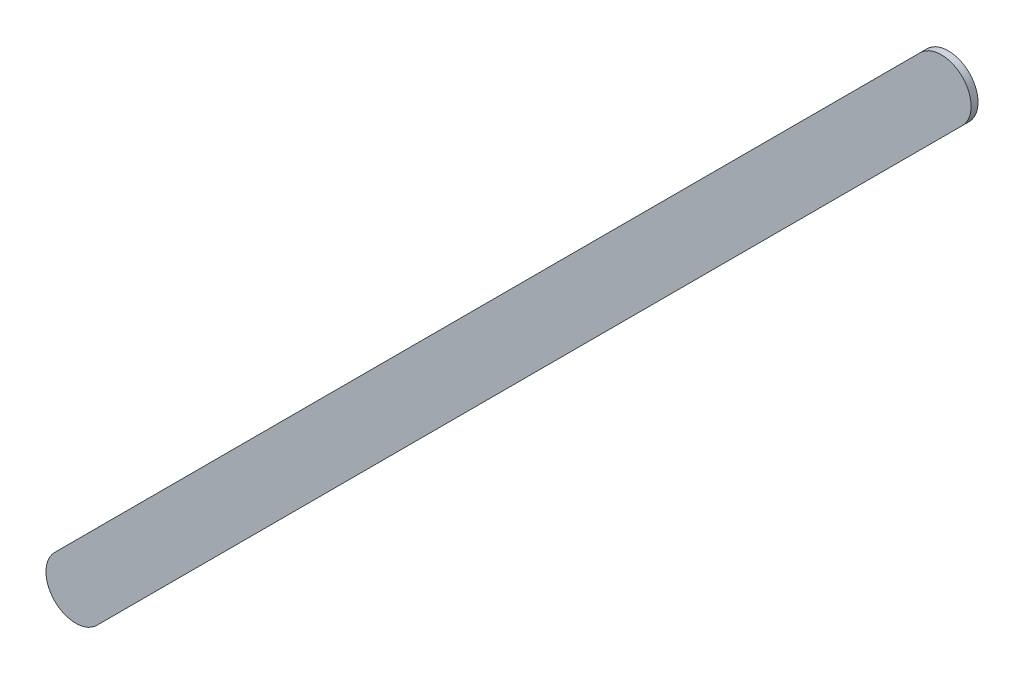
ISO-10303-21;
HEADER;
FILE_DESCRIPTION(('STEP AP214'),'2;1');
FILE_NAME('part.step','',(''),(''),'','','');
FILE_SCHEMA(('AUTOMOTIVE_DESIGN { 1 0 10303 214 1 1 1 1 }'));
ENDSEC;
DATA;
#1=APPLICATION_CONTEXT('core data for automotive mechanical design processes');
#2=APPLICATION_PROTOCOL_DEFINITION('international standard','automotive_design',2000,#1);
#3=PRODUCT_CONTEXT('',#1,'mechanical');
#4=PRODUCT('Part','Part','',(#3));
#5=PRODUCT_RELATED_PRODUCT_CATEGORY('part','',(#4));
#6=PRODUCT_DEFINITION_FORMATION('','',#4);
#7=PRODUCT_DEFINITION_CONTEXT('part definition',#1,'design');
#8=PRODUCT_DEFINITION('design','',#6,#7);
#9=PRODUCT_DEFINITION_SHAPE('','',#8);
#10=(LENGTH_UNIT() NAMED_UNIT(*) SI_UNIT(.MILLI.,.METRE.));
#11=(NAMED_UNIT(*) PLANE_ANGLE_UNIT() SI_UNIT($,.RADIAN.));
#12=(NAMED_UNIT(*) SI_UNIT($,.STERADIAN.) SOLID_ANGLE_UNIT());
#13=UNCERTAINTY_MEASURE_WITH_UNIT(LENGTH_MEASURE(1.E-05),#10,'distance_accuracy_value','');
#14=(GEOMETRIC_REPRESENTATION_CONTEXT(3) GLOBAL_UNCERTAINTY_ASSIGNED_CONTEXT((#13)) GLOBAL_UNIT_ASSIGNED_CONTEXT((#10,
#11,#12)) REPRESENTATION_CONTEXT('',''));
#15=CARTESIAN_POINT('',(0.,0.,0.));
#16=DIRECTION('',(0.,0.,1.));
#17=DIRECTION('',(1.,0.,0.));
#18=AXIS2_PLACEMENT_3D('',#15,#16,#17);
#19=CARTESIAN_POINT('',(122.273933,-85.213933,1.635));
#20=DIRECTION('',(0.,0.,1.));
#21=DIRECTION('',(1.,0.,0.));
#22=AXIS2_PLACEMENT_3D('',#19,#20,#21);
#23=PLANE('',#22);
#24=DIRECTION('',(-0.707106781186548,-0.707106781186548,0.));
#25=VECTOR('',#24,1.);
#26=CARTESIAN_POINT('',(122.273933,-85.213933,1.635));
#27=LINE('',#26,#25);
#28=CARTESIAN_POINT('',(122.273933,-85.213933,1.635));
#29=VERTEX_POINT('',#28);
#30=CARTESIAN_POINT('',(117.913933,-89.573933,1.635));
#31=VERTEX_POINT('',#30);
#32=EDGE_CURVE('E83',#29,#31,#27,.T.);
#33=ORIENTED_EDGE('',*,*,#32,.T.);
#34=CARTESIAN_POINT('',(118.0199995,-89.6799995,1.635));
#35=DIRECTION('',(0.,0.,1.));
#36=DIRECTION('',(-0.707106781186548,0.707106781186548,0.));
#37=AXIS2_PLACEMENT_3D('',#34,#35,#36);
#38=CIRCLE('',#37,0.150000682813);
#39=CARTESIAN_POINT('',(118.126066,-89.786066,1.635));
#40=VERTEX_POINT('',#39);
#41=EDGE_CURVE('E104',#31,#40,#38,.T.);
#42=ORIENTED_EDGE('',*,*,#41,.T.);
#43=DIRECTION('',(0.707106781186548,0.707106781186548,0.));
#44=VECTOR('',#43,1.);
#45=CARTESIAN_POINT('',(118.126066,-89.786066,1.635));
#46=LINE('',#45,#44);
#47=CARTESIAN_POINT('',(122.486066,-85.426066,1.635));
#48=VERTEX_POINT('',#47);
#49=EDGE_CURVE('E75',#40,#48,#46,.T.);
#50=ORIENTED_EDGE('',*,*,#49,.T.);
#51=CARTESIAN_POINT('',(122.3799995,-85.3199995,1.635));
#52=DIRECTION('',(0.,0.,1.));
#53=DIRECTION('',(0.707106781186548,-0.707106781186548,0.));
#54=AXIS2_PLACEMENT_3D('',#51,#52,#53);
#55=CIRCLE('',#54,0.150000682813);
#56=EDGE_CURVE('E11',#48,#29,#55,.T.);
#57=ORIENTED_EDGE('',*,*,#56,.T.);
#58=EDGE_LOOP('',(#33,#42,#50,#57));
#59=FACE_BOUND('',#58,.T.);
#60=ADVANCED_FACE('F17',(#59),#23,.T.);
#61=CARTESIAN_POINT('',(122.273933,-85.213933,1.6));
#62=DIRECTION('',(0.,0.,1.));
#63=DIRECTION('',(1.,0.,0.));
#64=AXIS2_PLACEMENT_3D('',#61,#62,#63);
#65=PLANE('',#64);
#66=CARTESIAN_POINT('',(122.3799995,-85.3199995,1.6));
#67=DIRECTION('',(0.,0.,1.));
#68=DIRECTION('',(0.707106781186548,-0.707106781186548,0.));
#69=AXIS2_PLACEMENT_3D('',#66,#67,#68);
#70=CIRCLE('',#69,0.150000682813);
#71=CARTESIAN_POINT('',(122.486066,-85.426066,1.6));
#72=VERTEX_POINT('',#71);
#73=CARTESIAN_POINT('',(122.273933,-85.213933,1.6));
#74=VERTEX_POINT('',#73);
#75=EDGE_CURVE('E26',#72,#74,#70,.T.);
#76=ORIENTED_EDGE('',*,*,#75,.F.);
#77=DIRECTION('',(0.707106781186548,0.707106781186548,0.));
#78=VECTOR('',#77,1.);
#79=CARTESIAN_POINT('',(118.126066,-89.786066,1.6));
#80=LINE('',#79,#78);
#81=CARTESIAN_POINT('',(118.126066,-89.786066,1.6));
#82=VERTEX_POINT('',#81);
#83=EDGE_CURVE('E103',#82,#72,#80,.T.);
#84=ORIENTED_EDGE('',*,*,#83,.F.);
#85=CARTESIAN_POINT('',(118.0199995,-89.6799995,1.6));
#86=DIRECTION('',(0.,0.,1.));
#87=DIRECTION('',(-0.707106781186548,0.707106781186548,0.));
#88=AXIS2_PLACEMENT_3D('',#85,#86,#87);
#89=CIRCLE('',#88,0.150000682813);
#90=CARTESIAN_POINT('',(117.913933,-89.573933,1.6));
#91=VERTEX_POINT('',#90);
#92=EDGE_CURVE('E85',#91,#82,#89,.T.);
#93=ORIENTED_EDGE('',*,*,#92,.F.);
#94=DIRECTION('',(-0.707106781186548,-0.707106781186548,0.));
#95=VECTOR('',#94,1.);
#96=CARTESIAN_POINT('',(122.273933,-85.213933,1.6));
#97=LINE('',#96,#95);
#98=EDGE_CURVE('E81',#74,#91,#97,.T.);
#99=ORIENTED_EDGE('',*,*,#98,.F.);
#100=EDGE_LOOP('',(#76,#84,#93,#99));
#101=FACE_BOUND('',#100,.T.);
#102=ADVANCED_FACE('F19',(#101),#65,.F.);
#103=CARTESIAN_POINT('',(122.3799995,-85.3199995,1.6));
#104=DIRECTION('',(0.,0.,-1.));
#105=DIRECTION('',(0.707106781186548,-0.707106781186548,0.));
#106=AXIS2_PLACEMENT_3D('',#103,#104,#105);
#107=CYLINDRICAL_SURFACE('',#106,0.150000682813);
#108=ORIENTED_EDGE('',*,*,#75,.T.);
#109=DIRECTION('',(0.,0.,1.));
#110=VECTOR('',#109,1.);
#111=CARTESIAN_POINT('',(122.273933,-85.213933,1.6));
#112=LINE('',#111,#110);
#113=EDGE_CURVE('E69',#74,#29,#112,.T.);
#114=ORIENTED_EDGE('',*,*,#113,.T.);
#115=ORIENTED_EDGE('',*,*,#56,.F.);
#116=DIRECTION('',(0.,0.,1.));
#117=VECTOR('',#116,1.);
#118=CARTESIAN_POINT('',(122.486066,-85.426066,1.6));
#119=LINE('',#118,#117);
#120=EDGE_CURVE('E72',#72,#48,#119,.T.);
#121=ORIENTED_EDGE('',*,*,#120,.F.);
#122=EDGE_LOOP('',(#108,#114,#115,#121));
#123=FACE_BOUND('',#122,.T.);
#124=ADVANCED_FACE('F68',(#123),#107,.T.);
#125=CARTESIAN_POINT('',(118.126066,-89.786066,1.6));
#126=DIRECTION('',(-0.707106781186548,0.707106781186548,0.));
#127=DIRECTION('',(0.,0.,1.));
#128=AXIS2_PLACEMENT_3D('',#125,#126,#127);
#129=PLANE('',#128);
#130=ORIENTED_EDGE('',*,*,#83,.T.);
#131=ORIENTED_EDGE('',*,*,#120,.T.);
#132=ORIENTED_EDGE('',*,*,#49,.F.);
#133=DIRECTION('',(0.,0.,1.));
#134=VECTOR('',#133,1.);
#135=CARTESIAN_POINT('',(118.126066,-89.786066,1.6));
#136=LINE('',#135,#134);
#137=EDGE_CURVE('E107',#82,#40,#136,.T.);
#138=ORIENTED_EDGE('',*,*,#137,.F.);
#139=EDGE_LOOP('',(#130,#131,#132,#138));
#140=FACE_BOUND('',#139,.T.);
#141=ADVANCED_FACE('F118',(#140),#129,.F.);
#142=CARTESIAN_POINT('',(118.0199995,-89.6799995,1.6));
#143=DIRECTION('',(0.,0.,-1.));
#144=DIRECTION('',(-0.707106781186548,0.707106781186548,0.));
#145=AXIS2_PLACEMENT_3D('',#142,#143,#144);
#146=CYLINDRICAL_SURFACE('',#145,0.150000682813);
#147=ORIENTED_EDGE('',*,*,#92,.T.);
#148=ORIENTED_EDGE('',*,*,#137,.T.);
#149=ORIENTED_EDGE('',*,*,#41,.F.);
#150=DIRECTION('',(0.,0.,1.));
#151=VECTOR('',#150,1.);
#152=CARTESIAN_POINT('',(117.913933,-89.573933,1.6));
#153=LINE('',#152,#151);
#154=EDGE_CURVE('E90',#91,#31,#153,.T.);
#155=ORIENTED_EDGE('',*,*,#154,.F.);
#156=EDGE_LOOP('',(#147,#148,#149,#155));
#157=FACE_BOUND('',#156,.T.);
#158=ADVANCED_FACE('F120',(#157),#146,.T.);
#159=CARTESIAN_POINT('',(122.273933,-85.213933,1.6));
#160=DIRECTION('',(0.707106781186548,-0.707106781186548,0.));
#161=DIRECTION('',(0.,0.,-1.));
#162=AXIS2_PLACEMENT_3D('',#159,#160,#161);
#163=PLANE('',#162);
#164=ORIENTED_EDGE('',*,*,#98,.T.);
#165=ORIENTED_EDGE('',*,*,#154,.T.);
#166=ORIENTED_EDGE('',*,*,#32,.F.);
#167=ORIENTED_EDGE('',*,*,#113,.F.);
#168=EDGE_LOOP('',(#164,#165,#166,#167));
#169=FACE_BOUND('',#168,.T.);
#170=ADVANCED_FACE('F79',(#169),#163,.F.);
#171=CLOSED_SHELL('',(#60,#102,#124,#141,#158,#170));
#172=MANIFOLD_SOLID_BREP('B1',#171);
#173=ADVANCED_BREP_SHAPE_REPRESENTATION('',(#18,#172),#14);
#174=SHAPE_DEFINITION_REPRESENTATION(#9,#173);
ENDSEC;
END-ISO-10303-21;
